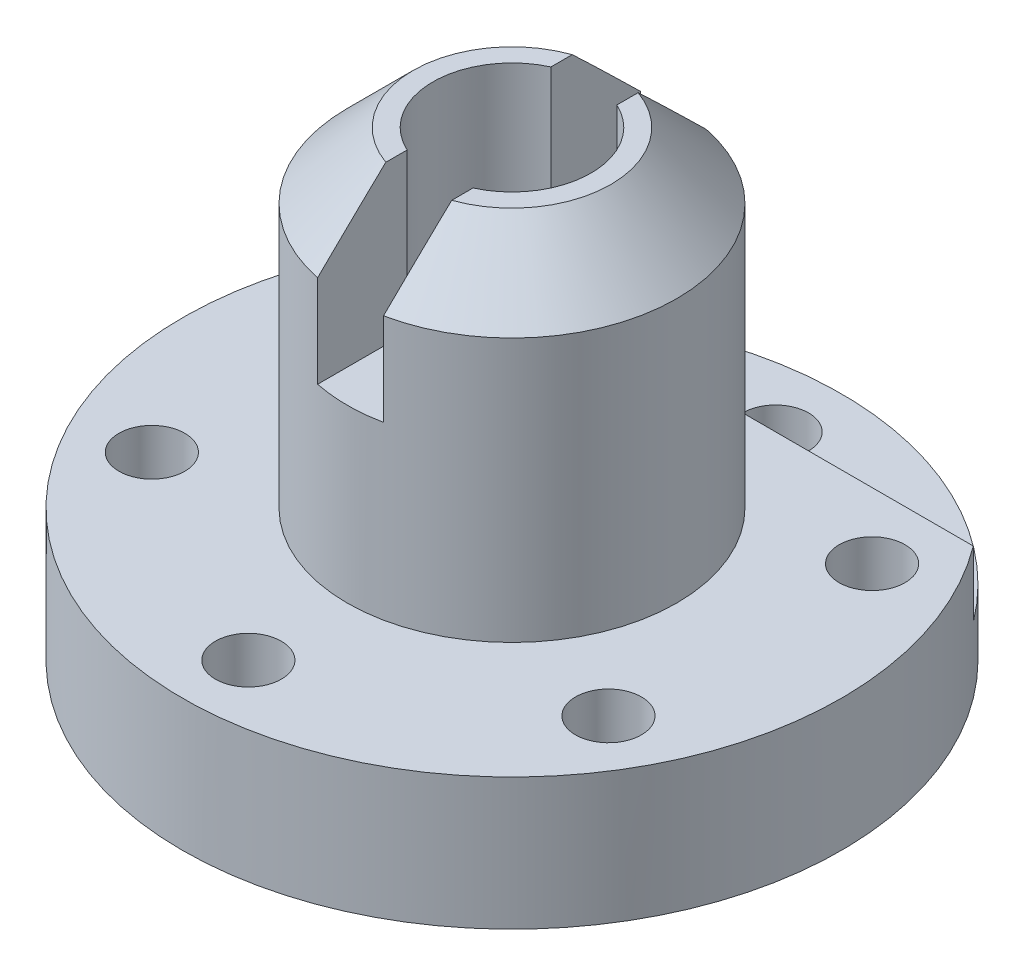
ISO-10303-21;
HEADER;
FILE_DESCRIPTION(('STEP AP214'),'2;1');
FILE_NAME('part.step','',(''),(''),'','','');
FILE_SCHEMA(('AUTOMOTIVE_DESIGN { 1 0 10303 214 1 1 1 1 }'));
ENDSEC;
DATA;
#1=APPLICATION_CONTEXT('core data for automotive mechanical design processes');
#2=APPLICATION_PROTOCOL_DEFINITION('international standard','automotive_design',2000,#1);
#3=PRODUCT_CONTEXT('',#1,'mechanical');
#4=PRODUCT('Part','Part','',(#3));
#5=PRODUCT_RELATED_PRODUCT_CATEGORY('part','',(#4));
#6=PRODUCT_DEFINITION_FORMATION('','',#4);
#7=PRODUCT_DEFINITION_CONTEXT('part definition',#1,'design');
#8=PRODUCT_DEFINITION('design','',#6,#7);
#9=PRODUCT_DEFINITION_SHAPE('','',#8);
#10=(LENGTH_UNIT() NAMED_UNIT(*) SI_UNIT(.MILLI.,.METRE.));
#11=(NAMED_UNIT(*) PLANE_ANGLE_UNIT() SI_UNIT($,.RADIAN.));
#12=(NAMED_UNIT(*) SI_UNIT($,.STERADIAN.) SOLID_ANGLE_UNIT());
#13=UNCERTAINTY_MEASURE_WITH_UNIT(LENGTH_MEASURE(1.E-05),#10,'distance_accuracy_value','');
#14=(GEOMETRIC_REPRESENTATION_CONTEXT(3) GLOBAL_UNCERTAINTY_ASSIGNED_CONTEXT((#13)) GLOBAL_UNIT_ASSIGNED_CONTEXT((#10,
#11,#12)) REPRESENTATION_CONTEXT('',''));
#15=CARTESIAN_POINT('',(0.,0.,0.));
#16=DIRECTION('',(0.,0.,1.));
#17=DIRECTION('',(1.,0.,0.));
#18=AXIS2_PLACEMENT_3D('',#15,#16,#17);
#19=CARTESIAN_POINT('',(0.,35.,0.));
#20=DIRECTION('',(0.,-1.,0.));
#21=DIRECTION('',(0.,0.,-1.));
#22=AXIS2_PLACEMENT_3D('',#19,#20,#21);
#23=CYLINDRICAL_SURFACE('',#22,6.);
#24=CARTESIAN_POINT('',(0.,10.,0.));
#25=DIRECTION('',(0.,1.,0.));
#26=DIRECTION('',(0.,0.,1.));
#27=AXIS2_PLACEMENT_3D('',#24,#25,#26);
#28=CIRCLE('',#27,6.);
#29=CARTESIAN_POINT('',(0.,10.,6.));
#30=VERTEX_POINT('',#29);
#31=EDGE_CURVE('E165',#30,#30,#28,.F.);
#32=ORIENTED_EDGE('',*,*,#31,.T.);
#33=EDGE_LOOP('',(#32));
#34=FACE_BOUND('',#33,.T.);
#35=CARTESIAN_POINT('',(0.,35.,0.));
#36=DIRECTION('',(0.,1.,0.));
#37=DIRECTION('',(0.,0.,1.));
#38=AXIS2_PLACEMENT_3D('',#35,#36,#37);
#39=CIRCLE('',#38,6.);
#40=CARTESIAN_POINT('',(-2.5,35.,-5.45435605731786));
#41=VERTEX_POINT('',#40);
#42=CARTESIAN_POINT('',(-2.5,35.,5.45435605731786));
#43=VERTEX_POINT('',#42);
#44=EDGE_CURVE('E155',#41,#43,#39,.T.);
#45=ORIENTED_EDGE('',*,*,#44,.T.);
#46=DIRECTION('',(0.,-1.,0.));
#47=VECTOR('',#46,1.);
#48=CARTESIAN_POINT('',(-2.5,35.,5.45435605731786));
#49=LINE('',#48,#47);
#50=CARTESIAN_POINT('',(-2.5,23.,5.45435605731786));
#51=VERTEX_POINT('',#50);
#52=EDGE_CURVE('E301',#43,#51,#49,.T.);
#53=ORIENTED_EDGE('',*,*,#52,.T.);
#54=CARTESIAN_POINT('',(0.,23.,0.));
#55=DIRECTION('',(0.,-1.,0.));
#56=DIRECTION('',(0.,0.,-1.));
#57=AXIS2_PLACEMENT_3D('',#54,#55,#56);
#58=CIRCLE('',#57,6.);
#59=CARTESIAN_POINT('',(2.5,23.,5.45435605731786));
#60=VERTEX_POINT('',#59);
#61=EDGE_CURVE('E147',#60,#51,#58,.T.);
#62=ORIENTED_EDGE('',*,*,#61,.F.);
#63=DIRECTION('',(0.,-1.,0.));
#64=VECTOR('',#63,1.);
#65=CARTESIAN_POINT('',(2.5,35.,5.45435605731786));
#66=LINE('',#65,#64);
#67=CARTESIAN_POINT('',(2.5,35.,5.45435605731786));
#68=VERTEX_POINT('',#67);
#69=EDGE_CURVE('E133',#68,#60,#66,.T.);
#70=ORIENTED_EDGE('',*,*,#69,.F.);
#71=CARTESIAN_POINT('',(2.5,35.,-5.45435605731786));
#72=VERTEX_POINT('',#71);
#73=EDGE_CURVE('E145',#68,#72,#39,.T.);
#74=ORIENTED_EDGE('',*,*,#73,.T.);
#75=DIRECTION('',(0.,-1.,0.));
#76=VECTOR('',#75,1.);
#77=CARTESIAN_POINT('',(2.5,35.,-5.45435605731786));
#78=LINE('',#77,#76);
#79=CARTESIAN_POINT('',(2.5,23.,-5.45435605731786));
#80=VERTEX_POINT('',#79);
#81=EDGE_CURVE('E149',#80,#72,#78,.F.);
#82=ORIENTED_EDGE('',*,*,#81,.F.);
#83=CARTESIAN_POINT('',(-2.5,23.,-5.45435605731786));
#84=VERTEX_POINT('',#83);
#85=EDGE_CURVE('E299',#84,#80,#58,.T.);
#86=ORIENTED_EDGE('',*,*,#85,.F.);
#87=DIRECTION('',(0.,-1.,0.));
#88=VECTOR('',#87,1.);
#89=CARTESIAN_POINT('',(-2.5,35.,-5.45435605731786));
#90=LINE('',#89,#88);
#91=EDGE_CURVE('E303',#84,#41,#90,.F.);
#92=ORIENTED_EDGE('',*,*,#91,.T.);
#93=EDGE_LOOP('',(#45,#53,#62,#70,#74,#82,#86,#92));
#94=FACE_BOUND('',#93,.T.);
#95=ADVANCED_FACE('F39',(#34,#94),#23,.F.);
#96=CARTESIAN_POINT('',(0.,35.,0.));
#97=DIRECTION('',(0.,-1.,0.));
#98=DIRECTION('',(0.,0.,-1.));
#99=AXIS2_PLACEMENT_3D('',#96,#97,#98);
#100=CYLINDRICAL_SURFACE('',#99,12.5);
#101=CARTESIAN_POINT('',(0.,10.,0.));
#102=DIRECTION('',(0.,1.,0.));
#103=DIRECTION('',(0.,0.,1.));
#104=AXIS2_PLACEMENT_3D('',#101,#102,#103);
#105=CIRCLE('',#104,12.5);
#106=CARTESIAN_POINT('',(0.,10.,12.5));
#107=VERTEX_POINT('',#106);
#108=EDGE_CURVE('E154',#107,#107,#105,.F.);
#109=ORIENTED_EDGE('',*,*,#108,.F.);
#110=EDGE_LOOP('',(#109));
#111=FACE_BOUND('',#110,.T.);
#112=DIRECTION('',(0.,-1.,0.));
#113=VECTOR('',#112,1.);
#114=CARTESIAN_POINT('',(-2.5,35.,12.2474487139159));
#115=LINE('',#114,#113);
#116=CARTESIAN_POINT('',(-2.5,30.,12.2474487139159));
#117=VERTEX_POINT('',#116);
#118=CARTESIAN_POINT('',(-2.5,23.,12.2474487139159));
#119=VERTEX_POINT('',#118);
#120=EDGE_CURVE('E306',#117,#119,#115,.T.);
#121=ORIENTED_EDGE('',*,*,#120,.F.);
#122=CARTESIAN_POINT('',(0.,30.,0.));
#123=DIRECTION('',(0.,1.,0.));
#124=DIRECTION('',(0.,0.,1.));
#125=AXIS2_PLACEMENT_3D('',#122,#123,#124);
#126=CIRCLE('',#125,12.5);
#127=CARTESIAN_POINT('',(-2.5,30.,-12.2474487139159));
#128=VERTEX_POINT('',#127);
#129=EDGE_CURVE('E215',#117,#128,#126,.F.);
#130=ORIENTED_EDGE('',*,*,#129,.T.);
#131=DIRECTION('',(0.,-1.,0.));
#132=VECTOR('',#131,1.);
#133=CARTESIAN_POINT('',(-2.5,35.,-12.2474487139159));
#134=LINE('',#133,#132);
#135=CARTESIAN_POINT('',(-2.5,23.,-12.2474487139159));
#136=VERTEX_POINT('',#135);
#137=EDGE_CURVE('E148',#136,#128,#134,.F.);
#138=ORIENTED_EDGE('',*,*,#137,.F.);
#139=CARTESIAN_POINT('',(0.,23.,0.));
#140=DIRECTION('',(0.,-1.,0.));
#141=DIRECTION('',(0.,0.,-1.));
#142=AXIS2_PLACEMENT_3D('',#139,#140,#141);
#143=CIRCLE('',#142,12.5);
#144=CARTESIAN_POINT('',(2.5,23.,-12.2474487139159));
#145=VERTEX_POINT('',#144);
#146=EDGE_CURVE('E176',#136,#145,#143,.T.);
#147=ORIENTED_EDGE('',*,*,#146,.T.);
#148=DIRECTION('',(0.,-1.,0.));
#149=VECTOR('',#148,1.);
#150=CARTESIAN_POINT('',(2.5,35.,-12.2474487139159));
#151=LINE('',#150,#149);
#152=CARTESIAN_POINT('',(2.5,30.,-12.2474487139159));
#153=VERTEX_POINT('',#152);
#154=EDGE_CURVE('E313',#145,#153,#151,.F.);
#155=ORIENTED_EDGE('',*,*,#154,.T.);
#156=CARTESIAN_POINT('',(0.,30.,0.));
#157=DIRECTION('',(0.,1.,0.));
#158=DIRECTION('',(0.,0.,1.));
#159=AXIS2_PLACEMENT_3D('',#156,#157,#158);
#160=CIRCLE('',#159,12.5);
#161=CARTESIAN_POINT('',(2.5,30.,12.2474487139159));
#162=VERTEX_POINT('',#161);
#163=EDGE_CURVE('E194',#153,#162,#160,.F.);
#164=ORIENTED_EDGE('',*,*,#163,.T.);
#165=DIRECTION('',(0.,-1.,0.));
#166=VECTOR('',#165,1.);
#167=CARTESIAN_POINT('',(2.5,35.,12.2474487139159));
#168=LINE('',#167,#166);
#169=CARTESIAN_POINT('',(2.5,23.,12.2474487139159));
#170=VERTEX_POINT('',#169);
#171=EDGE_CURVE('E311',#162,#170,#168,.T.);
#172=ORIENTED_EDGE('',*,*,#171,.T.);
#173=EDGE_CURVE('E179',#170,#119,#143,.T.);
#174=ORIENTED_EDGE('',*,*,#173,.T.);
#175=EDGE_LOOP('',(#121,#130,#138,#147,#155,#164,#172,#174));
#176=FACE_BOUND('',#175,.T.);
#177=ADVANCED_FACE('F243',(#111,#176),#100,.T.);
#178=CARTESIAN_POINT('',(0.,35.,0.));
#179=DIRECTION('',(0.,1.,0.));
#180=DIRECTION('',(0.,0.,1.));
#181=AXIS2_PLACEMENT_3D('',#178,#179,#180);
#182=PLANE('',#181);
#183=DIRECTION('',(0.,0.,-1.));
#184=VECTOR('',#183,1.);
#185=CARTESIAN_POINT('',(-2.5,35.,0.));
#186=LINE('',#185,#184);
#187=CARTESIAN_POINT('',(-2.5,35.,-7.07106781186548));
#188=VERTEX_POINT('',#187);
#189=EDGE_CURVE('E137',#41,#188,#186,.T.);
#190=ORIENTED_EDGE('',*,*,#189,.T.);
#191=CARTESIAN_POINT('',(0.,35.,0.));
#192=DIRECTION('',(0.,1.,0.));
#193=DIRECTION('',(0.,0.,1.));
#194=AXIS2_PLACEMENT_3D('',#191,#192,#193);
#195=CIRCLE('',#194,7.5);
#196=CARTESIAN_POINT('',(-2.5,35.,7.07106781186548));
#197=VERTEX_POINT('',#196);
#198=EDGE_CURVE('E185',#188,#197,#195,.T.);
#199=ORIENTED_EDGE('',*,*,#198,.T.);
#200=EDGE_CURVE('E175',#197,#43,#186,.T.);
#201=ORIENTED_EDGE('',*,*,#200,.T.);
#202=ORIENTED_EDGE('',*,*,#44,.F.);
#203=EDGE_LOOP('',(#190,#199,#201,#202));
#204=FACE_BOUND('',#203,.T.);
#205=ADVANCED_FACE('F242',(#204),#182,.T.);
#206=CARTESIAN_POINT('',(0.,10.,0.));
#207=DIRECTION('',(0.,-1.,0.));
#208=DIRECTION('',(0.,0.,-1.));
#209=AXIS2_PLACEMENT_3D('',#206,#207,#208);
#210=CYLINDRICAL_SURFACE('',#209,25.);
#211=CARTESIAN_POINT('',(0.,0.,0.));
#212=DIRECTION('',(0.,1.,0.));
#213=DIRECTION('',(0.,0.,1.));
#214=AXIS2_PLACEMENT_3D('',#211,#212,#213);
#215=CIRCLE('',#214,25.);
#216=CARTESIAN_POINT('',(0.,0.,25.));
#217=VERTEX_POINT('',#216);
#218=EDGE_CURVE('E158',#217,#217,#215,.T.);
#219=ORIENTED_EDGE('',*,*,#218,.T.);
#220=EDGE_LOOP('',(#219));
#221=FACE_BOUND('',#220,.T.);
#222=DIRECTION('',(0.,-1.,0.));
#223=VECTOR('',#222,1.);
#224=CARTESIAN_POINT('',(20.,51.2310562561766,-15.));
#225=LINE('',#224,#223);
#226=CARTESIAN_POINT('',(20.,10.,-15.));
#227=VERTEX_POINT('',#226);
#228=CARTESIAN_POINT('',(20.,5.,-15.));
#229=VERTEX_POINT('',#228);
#230=EDGE_CURVE('E287',#227,#229,#225,.T.);
#231=ORIENTED_EDGE('',*,*,#230,.F.);
#232=CARTESIAN_POINT('',(0.,10.,0.));
#233=DIRECTION('',(0.,1.,0.));
#234=DIRECTION('',(0.,0.,1.));
#235=AXIS2_PLACEMENT_3D('',#232,#233,#234);
#236=CIRCLE('',#235,25.);
#237=CARTESIAN_POINT('',(-20.,10.,-15.));
#238=VERTEX_POINT('',#237);
#239=EDGE_CURVE('E168',#238,#227,#236,.T.);
#240=ORIENTED_EDGE('',*,*,#239,.F.);
#241=DIRECTION('',(0.,-1.,0.));
#242=VECTOR('',#241,1.);
#243=CARTESIAN_POINT('',(-20.,51.2310562561766,-15.));
#244=LINE('',#243,#242);
#245=CARTESIAN_POINT('',(-20.,5.,-15.));
#246=VERTEX_POINT('',#245);
#247=EDGE_CURVE('E162',#238,#246,#244,.T.);
#248=ORIENTED_EDGE('',*,*,#247,.T.);
#249=CARTESIAN_POINT('',(0.,5.,0.));
#250=DIRECTION('',(0.,1.,0.));
#251=DIRECTION('',(0.,0.,1.));
#252=AXIS2_PLACEMENT_3D('',#249,#250,#251);
#253=CIRCLE('',#252,25.);
#254=EDGE_CURVE('E289',#229,#246,#253,.T.);
#255=ORIENTED_EDGE('',*,*,#254,.F.);
#256=EDGE_LOOP('',(#231,#240,#248,#255));
#257=FACE_BOUND('',#256,.T.);
#258=ADVANCED_FACE('F205',(#221,#257),#210,.T.);
#259=CARTESIAN_POINT('',(0.,10.,0.));
#260=DIRECTION('',(0.,1.,0.));
#261=DIRECTION('',(0.,0.,1.));
#262=AXIS2_PLACEMENT_3D('',#259,#260,#261);
#263=PLANE('',#262);
#264=CARTESIAN_POINT('',(17.3205080756887,10.,-10.0000000000002));
#265=DIRECTION('',(0.,1.,0.));
#266=DIRECTION('',(0.,0.,1.));
#267=AXIS2_PLACEMENT_3D('',#264,#265,#266);
#268=CIRCLE('',#267,2.5);
#269=CARTESIAN_POINT('',(17.3205080756887,10.,-7.5000000000002));
#270=VERTEX_POINT('',#269);
#271=EDGE_CURVE('E323',#270,#270,#268,.F.);
#272=ORIENTED_EDGE('',*,*,#271,.T.);
#273=EDGE_LOOP('',(#272));
#274=FACE_BOUND('',#273,.T.);
#275=CARTESIAN_POINT('',(17.3205080756889,10.,9.99999999999984));
#276=DIRECTION('',(0.,1.,0.));
#277=DIRECTION('',(0.,0.,1.));
#278=AXIS2_PLACEMENT_3D('',#275,#276,#277);
#279=CIRCLE('',#278,2.5);
#280=CARTESIAN_POINT('',(17.3205080756889,10.,12.4999999999998));
#281=VERTEX_POINT('',#280);
#282=EDGE_CURVE('E326',#281,#281,#279,.F.);
#283=ORIENTED_EDGE('',*,*,#282,.T.);
#284=EDGE_LOOP('',(#283));
#285=FACE_BOUND('',#284,.T.);
#286=CARTESIAN_POINT('',(0.,10.,20.));
#287=DIRECTION('',(0.,1.,0.));
#288=DIRECTION('',(0.,0.,1.));
#289=AXIS2_PLACEMENT_3D('',#286,#287,#288);
#290=CIRCLE('',#289,2.5);
#291=CARTESIAN_POINT('',(0.,10.,22.5));
#292=VERTEX_POINT('',#291);
#293=EDGE_CURVE('E329',#292,#292,#290,.F.);
#294=ORIENTED_EDGE('',*,*,#293,.T.);
#295=EDGE_LOOP('',(#294));
#296=FACE_BOUND('',#295,.T.);
#297=CARTESIAN_POINT('',(-17.3205080756887,10.,10.0000000000001));
#298=DIRECTION('',(0.,1.,0.));
#299=DIRECTION('',(0.,0.,1.));
#300=AXIS2_PLACEMENT_3D('',#297,#298,#299);
#301=CIRCLE('',#300,2.5);
#302=CARTESIAN_POINT('',(-17.3205080756887,10.,12.5000000000001));
#303=VERTEX_POINT('',#302);
#304=EDGE_CURVE('E332',#303,#303,#301,.F.);
#305=ORIENTED_EDGE('',*,*,#304,.T.);
#306=EDGE_LOOP('',(#305));
#307=FACE_BOUND('',#306,.T.);
#308=CARTESIAN_POINT('',(-17.3205080756888,10.,-9.99999999999996));
#309=DIRECTION('',(0.,1.,0.));
#310=DIRECTION('',(0.,0.,1.));
#311=AXIS2_PLACEMENT_3D('',#308,#309,#310);
#312=CIRCLE('',#311,2.5);
#313=CARTESIAN_POINT('',(-17.3205080756888,10.,-7.49999999999996));
#314=VERTEX_POINT('',#313);
#315=EDGE_CURVE('E335',#314,#314,#312,.F.);
#316=ORIENTED_EDGE('',*,*,#315,.T.);
#317=EDGE_LOOP('',(#316));
#318=FACE_BOUND('',#317,.T.);
#319=ORIENTED_EDGE('',*,*,#108,.T.);
#320=EDGE_LOOP('',(#319));
#321=FACE_BOUND('',#320,.T.);
#322=ORIENTED_EDGE('',*,*,#239,.T.);
#323=DIRECTION('',(1.,0.,0.));
#324=VECTOR('',#323,1.);
#325=CARTESIAN_POINT('',(0.,10.,-15.));
#326=LINE('',#325,#324);
#327=EDGE_CURVE('E160',#238,#227,#326,.T.);
#328=ORIENTED_EDGE('',*,*,#327,.F.);
#329=EDGE_LOOP('',(#322,#328));
#330=FACE_BOUND('',#329,.T.);
#331=ADVANCED_FACE('F250',(#274,#285,#296,#307,#318,#321,#330),#263,.T.);
#332=CARTESIAN_POINT('',(0.,0.,0.));
#333=DIRECTION('',(0.,1.,0.));
#334=DIRECTION('',(0.,0.,1.));
#335=AXIS2_PLACEMENT_3D('',#332,#333,#334);
#336=PLANE('',#335);
#337=CARTESIAN_POINT('',(17.3205080756887,0.,-10.0000000000002));
#338=DIRECTION('',(0.,1.,0.));
#339=DIRECTION('',(-0.866025403784433,0.,0.50000000000001));
#340=AXIS2_PLACEMENT_3D('',#337,#338,#339);
#341=CIRCLE('',#340,2.5);
#342=CARTESIAN_POINT('',(15.1554445662276,0.,-8.75000000000018));
#343=VERTEX_POINT('',#342);
#344=EDGE_CURVE('E260',#343,#343,#341,.T.);
#345=ORIENTED_EDGE('',*,*,#344,.T.);
#346=EDGE_LOOP('',(#345));
#347=FACE_BOUND('',#346,.T.);
#348=CARTESIAN_POINT('',(17.3205080756889,0.,9.99999999999984));
#349=DIRECTION('',(0.,1.,0.));
#350=DIRECTION('',(-0.866025403784443,0.,-0.499999999999992));
#351=AXIS2_PLACEMENT_3D('',#348,#349,#350);
#352=CIRCLE('',#351,2.5);
#353=CARTESIAN_POINT('',(15.1554445662278,0.,8.74999999999986));
#354=VERTEX_POINT('',#353);
#355=EDGE_CURVE('E264',#354,#354,#352,.T.);
#356=ORIENTED_EDGE('',*,*,#355,.T.);
#357=EDGE_LOOP('',(#356));
#358=FACE_BOUND('',#357,.T.);
#359=CARTESIAN_POINT('',(0.,0.,20.));
#360=DIRECTION('',(0.,1.,0.));
#361=DIRECTION('',(0.,0.,-1.));
#362=AXIS2_PLACEMENT_3D('',#359,#360,#361);
#363=CIRCLE('',#362,2.5);
#364=CARTESIAN_POINT('',(0.,0.,17.5));
#365=VERTEX_POINT('',#364);
#366=EDGE_CURVE('E268',#365,#365,#363,.T.);
#367=ORIENTED_EDGE('',*,*,#366,.T.);
#368=EDGE_LOOP('',(#367));
#369=FACE_BOUND('',#368,.T.);
#370=CARTESIAN_POINT('',(-17.3205080756887,0.,10.0000000000001));
#371=DIRECTION('',(0.,1.,0.));
#372=DIRECTION('',(0.866025403784436,0.,-0.500000000000004));
#373=AXIS2_PLACEMENT_3D('',#370,#371,#372);
#374=CIRCLE('',#373,2.5);
#375=CARTESIAN_POINT('',(-15.1554445662276,0.,8.75000000000007));
#376=VERTEX_POINT('',#375);
#377=EDGE_CURVE('E272',#376,#376,#374,.T.);
#378=ORIENTED_EDGE('',*,*,#377,.T.);
#379=EDGE_LOOP('',(#378));
#380=FACE_BOUND('',#379,.T.);
#381=CARTESIAN_POINT('',(-17.3205080756888,0.,-9.99999999999996));
#382=DIRECTION('',(0.,1.,0.));
#383=DIRECTION('',(0.86602540378444,0.,0.499999999999998));
#384=AXIS2_PLACEMENT_3D('',#381,#382,#383);
#385=CIRCLE('',#384,2.5);
#386=CARTESIAN_POINT('',(-15.1554445662277,0.,-8.74999999999997));
#387=VERTEX_POINT('',#386);
#388=EDGE_CURVE('E276',#387,#387,#385,.T.);
#389=ORIENTED_EDGE('',*,*,#388,.T.);
#390=EDGE_LOOP('',(#389));
#391=FACE_BOUND('',#390,.T.);
#392=CARTESIAN_POINT('',(0.,0.,-20.));
#393=DIRECTION('',(0.,1.,0.));
#394=DIRECTION('',(0.,0.,1.));
#395=AXIS2_PLACEMENT_3D('',#392,#393,#394);
#396=CIRCLE('',#395,2.5);
#397=CARTESIAN_POINT('',(0.,0.,-17.5));
#398=VERTEX_POINT('',#397);
#399=EDGE_CURVE('E184',#398,#398,#396,.T.);
#400=ORIENTED_EDGE('',*,*,#399,.T.);
#401=EDGE_LOOP('',(#400));
#402=FACE_BOUND('',#401,.T.);
#403=ORIENTED_EDGE('',*,*,#218,.F.);
#404=EDGE_LOOP('',(#403));
#405=FACE_BOUND('',#404,.T.);
#406=ADVANCED_FACE('F241',(#347,#358,#369,#380,#391,#402,#405),#336,.F.);
#407=DIRECTION('',(0.,0.,-1.));
#408=VECTOR('',#407,1.);
#409=CARTESIAN_POINT('',(2.5,35.,0.));
#410=LINE('',#409,#408);
#411=CARTESIAN_POINT('',(2.5,35.,7.07106781186547));
#412=VERTEX_POINT('',#411);
#413=EDGE_CURVE('E129',#412,#68,#410,.T.);
#414=ORIENTED_EDGE('',*,*,#413,.F.);
#415=CARTESIAN_POINT('',(0.,35.,0.));
#416=DIRECTION('',(0.,1.,0.));
#417=DIRECTION('',(0.,0.,1.));
#418=AXIS2_PLACEMENT_3D('',#415,#416,#417);
#419=CIRCLE('',#418,7.5);
#420=CARTESIAN_POINT('',(2.5,35.,-7.07106781186547));
#421=VERTEX_POINT('',#420);
#422=EDGE_CURVE('E214',#412,#421,#419,.T.);
#423=ORIENTED_EDGE('',*,*,#422,.T.);
#424=EDGE_CURVE('E138',#72,#421,#410,.T.);
#425=ORIENTED_EDGE('',*,*,#424,.F.);
#426=ORIENTED_EDGE('',*,*,#73,.F.);
#427=EDGE_LOOP('',(#414,#423,#425,#426));
#428=FACE_BOUND('',#427,.T.);
#429=ADVANCED_FACE('F152',(#428),#182,.T.);
#430=ORIENTED_EDGE('',*,*,#31,.F.);
#431=EDGE_LOOP('',(#430));
#432=FACE_BOUND('',#431,.T.);
#433=ADVANCED_FACE('F237',(#432),#263,.T.);
#434=CARTESIAN_POINT('',(0.,51.2310562561766,-15.));
#435=DIRECTION('',(0.,0.,-1.));
#436=DIRECTION('',(-1.,0.,0.));
#437=AXIS2_PLACEMENT_3D('',#434,#435,#436);
#438=PLANE('',#437);
#439=ORIENTED_EDGE('',*,*,#327,.T.);
#440=ORIENTED_EDGE('',*,*,#230,.T.);
#441=DIRECTION('',(1.,0.,0.));
#442=VECTOR('',#441,1.);
#443=CARTESIAN_POINT('',(0.,5.,-15.));
#444=LINE('',#443,#442);
#445=EDGE_CURVE('E292',#246,#229,#444,.T.);
#446=ORIENTED_EDGE('',*,*,#445,.F.);
#447=ORIENTED_EDGE('',*,*,#247,.F.);
#448=EDGE_LOOP('',(#439,#440,#446,#447));
#449=FACE_BOUND('',#448,.T.);
#450=ADVANCED_FACE('F233',(#449),#438,.T.);
#451=CARTESIAN_POINT('',(0.,5.,0.));
#452=DIRECTION('',(0.,1.,0.));
#453=DIRECTION('',(0.,0.,1.));
#454=AXIS2_PLACEMENT_3D('',#451,#452,#453);
#455=PLANE('',#454);
#456=CARTESIAN_POINT('',(0.,5.,-20.));
#457=DIRECTION('',(0.,1.,0.));
#458=DIRECTION('',(0.,0.,1.));
#459=AXIS2_PLACEMENT_3D('',#456,#457,#458);
#460=CIRCLE('',#459,2.5);
#461=CARTESIAN_POINT('',(0.,5.,-17.5));
#462=VERTEX_POINT('',#461);
#463=EDGE_CURVE('E180',#462,#462,#460,.F.);
#464=ORIENTED_EDGE('',*,*,#463,.T.);
#465=EDGE_LOOP('',(#464));
#466=FACE_BOUND('',#465,.T.);
#467=ORIENTED_EDGE('',*,*,#445,.T.);
#468=ORIENTED_EDGE('',*,*,#254,.T.);
#469=EDGE_LOOP('',(#467,#468));
#470=FACE_BOUND('',#469,.T.);
#471=ADVANCED_FACE('F230',(#466,#470),#455,.T.);
#472=CARTESIAN_POINT('',(2.5,0.,-25.));
#473=DIRECTION('',(1.,0.,0.));
#474=DIRECTION('',(0.,0.,-1.));
#475=AXIS2_PLACEMENT_3D('',#472,#473,#474);
#476=PLANE('',#475);
#477=ORIENTED_EDGE('',*,*,#424,.T.);
#478=CARTESIAN_POINT('',(2.5,35.,-7.07106781186547));
#479=CARTESIAN_POINT('',(2.5,34.7942710151592,-7.28925185426982));
#480=CARTESIAN_POINT('',(2.5,34.5880077931108,-7.50693046196766));
#481=CARTESIAN_POINT('',(2.5,34.1746086681922,-7.94145534958885));
#482=CARTESIAN_POINT('',(2.5,33.96747277022,-8.15830163417075));
#483=CARTESIAN_POINT('',(2.5,33.5525259791795,-8.59133847307312));
#484=CARTESIAN_POINT('',(2.5,33.3447150998693,-8.80752904058768));
#485=CARTESIAN_POINT('',(2.5,32.928541956577,-9.23937931718984));
#486=CARTESIAN_POINT('',(2.5,32.7201796917115,-9.45503902542584));
#487=CARTESIAN_POINT('',(2.5,32.0944309736618,-10.101364328682));
#488=CARTESIAN_POINT('',(2.5,31.6763761449851,-10.5313828218528));
#489=CARTESIAN_POINT('',(2.5,31.0483673520427,-11.175514838877));
#490=CARTESIAN_POINT('',(2.5,30.8388744262294,-11.3900785049165));
#491=CARTESIAN_POINT('',(2.5,30.4196245491057,-11.8189471296121));
#492=CARTESIAN_POINT('',(2.5,30.2098675981866,-12.0332520886506));
#493=CARTESIAN_POINT('',(2.5,30.,-12.2474487139159));
#494=B_SPLINE_CURVE_WITH_KNOTS('',3,(#478,#479,#480,#481,#482,#483,#484,#485,#486,#487,#488,
#489,#490,#491,#492,#493),.UNSPECIFIED.,.F.,.F.,(4,2,2,2,2,2,2,4),(0.,0.899640709374006,
1.79927637603901,2.69889381883337,3.59851270381598,5.3977225269921,6.29734660486977,
7.19696935114769),.UNSPECIFIED.);
#495=EDGE_CURVE('E52',#421,#153,#494,.T.);
#496=ORIENTED_EDGE('',*,*,#495,.T.);
#497=ORIENTED_EDGE('',*,*,#154,.F.);
#498=DIRECTION('',(0.,0.,1.));
#499=VECTOR('',#498,1.);
#500=CARTESIAN_POINT('',(2.5,23.,-25.));
#501=LINE('',#500,#499);
#502=EDGE_CURVE('E318',#145,#80,#501,.T.);
#503=ORIENTED_EDGE('',*,*,#502,.T.);
#504=ORIENTED_EDGE('',*,*,#81,.T.);
#505=EDGE_LOOP('',(#477,#496,#497,#503,#504));
#506=FACE_BOUND('',#505,.T.);
#507=ADVANCED_FACE('F223',(#506),#476,.F.);
#508=CARTESIAN_POINT('',(-2.5,0.,-25.));
#509=DIRECTION('',(1.,0.,0.));
#510=DIRECTION('',(0.,0.,-1.));
#511=AXIS2_PLACEMENT_3D('',#508,#509,#510);
#512=PLANE('',#511);
#513=ORIENTED_EDGE('',*,*,#137,.T.);
#514=CARTESIAN_POINT('',(-2.5,30.,-12.2474487139159));
#515=CARTESIAN_POINT('',(-2.5,30.2098675981865,-12.0332520886506));
#516=CARTESIAN_POINT('',(-2.5,30.4196245491057,-11.8189471296121));
#517=CARTESIAN_POINT('',(-2.5,30.8388744262294,-11.3900785049165));
#518=CARTESIAN_POINT('',(-2.5,31.0483673520427,-11.175514838877));
#519=CARTESIAN_POINT('',(-2.5,31.6763761449851,-10.5313828218528));
#520=CARTESIAN_POINT('',(-2.5,32.0944309736618,-10.101364328682));
#521=CARTESIAN_POINT('',(-2.5,32.7201796917115,-9.45503902542585));
#522=CARTESIAN_POINT('',(-2.5,32.928541956577,-9.23937931718984));
#523=CARTESIAN_POINT('',(-2.5,33.3447150998693,-8.80752904058769));
#524=CARTESIAN_POINT('',(-2.5,33.5525259791795,-8.59133847307312));
#525=CARTESIAN_POINT('',(-2.5,33.96747277022,-8.15830163417075));
#526=CARTESIAN_POINT('',(-2.5,34.1746086681922,-7.94145534958885));
#527=CARTESIAN_POINT('',(-2.5,34.5880077931108,-7.50693046196766));
#528=CARTESIAN_POINT('',(-2.5,34.7942710151592,-7.28925185426982));
#529=CARTESIAN_POINT('',(-2.5,35.,-7.07106781186548));
#530=B_SPLINE_CURVE_WITH_KNOTS('',3,(#514,#515,#516,#517,#518,#519,#520,#521,#522,#523,#524,
#525,#526,#527,#528,#529),.UNSPECIFIED.,.F.,.F.,(4,2,2,2,2,2,2,4),(0.,0.899622746277924,
1.79924682415559,3.59845664733171,4.49807553231432,5.39769297510868,6.29732864177369,
7.19696935114769),.UNSPECIFIED.);
#531=EDGE_CURVE('E209',#128,#188,#530,.T.);
#532=ORIENTED_EDGE('',*,*,#531,.T.);
#533=ORIENTED_EDGE('',*,*,#189,.F.);
#534=ORIENTED_EDGE('',*,*,#91,.F.);
#535=DIRECTION('',(0.,0.,1.));
#536=VECTOR('',#535,1.);
#537=CARTESIAN_POINT('',(-2.5,23.,-25.));
#538=LINE('',#537,#536);
#539=EDGE_CURVE('E316',#136,#84,#538,.T.);
#540=ORIENTED_EDGE('',*,*,#539,.F.);
#541=EDGE_LOOP('',(#513,#532,#533,#534,#540));
#542=FACE_BOUND('',#541,.T.);
#543=ADVANCED_FACE('F436',(#542),#512,.T.);
#544=CARTESIAN_POINT('',(0.,23.,-25.));
#545=DIRECTION('',(0.,-1.,0.));
#546=DIRECTION('',(0.,0.,-1.));
#547=AXIS2_PLACEMENT_3D('',#544,#545,#546);
#548=PLANE('',#547);
#549=ORIENTED_EDGE('',*,*,#85,.T.);
#550=ORIENTED_EDGE('',*,*,#502,.F.);
#551=ORIENTED_EDGE('',*,*,#146,.F.);
#552=ORIENTED_EDGE('',*,*,#539,.T.);
#553=EDGE_LOOP('',(#549,#550,#551,#552));
#554=FACE_BOUND('',#553,.T.);
#555=ADVANCED_FACE('F228',(#554),#548,.F.);
#556=ORIENTED_EDGE('',*,*,#61,.T.);
#557=EDGE_CURVE('E319',#51,#119,#538,.T.);
#558=ORIENTED_EDGE('',*,*,#557,.T.);
#559=ORIENTED_EDGE('',*,*,#173,.F.);
#560=EDGE_CURVE('E183',#60,#170,#501,.T.);
#561=ORIENTED_EDGE('',*,*,#560,.F.);
#562=EDGE_LOOP('',(#556,#558,#559,#561));
#563=FACE_BOUND('',#562,.T.);
#564=ADVANCED_FACE('F224',(#563),#548,.F.);
#565=ORIENTED_EDGE('',*,*,#200,.F.);
#566=CARTESIAN_POINT('',(-2.5,35.,7.07106781186548));
#567=CARTESIAN_POINT('',(-2.5,34.7942710151592,7.28925185426982));
#568=CARTESIAN_POINT('',(-2.5,34.5880077931108,7.50693046196766));
#569=CARTESIAN_POINT('',(-2.5,34.1746086681922,7.94145534958885));
#570=CARTESIAN_POINT('',(-2.5,33.96747277022,8.15830163417075));
#571=CARTESIAN_POINT('',(-2.5,33.5525259791795,8.59133847307312));
#572=CARTESIAN_POINT('',(-2.5,33.3447150998693,8.80752904058768));
#573=CARTESIAN_POINT('',(-2.5,32.928541956577,9.23937931718984));
#574=CARTESIAN_POINT('',(-2.5,32.7201796917115,9.45503902542585));
#575=CARTESIAN_POINT('',(-2.5,32.0944309736618,10.101364328682));
#576=CARTESIAN_POINT('',(-2.5,31.6763761449851,10.5313828218528));
#577=CARTESIAN_POINT('',(-2.5,31.0483673520427,11.175514838877));
#578=CARTESIAN_POINT('',(-2.5,30.8388744262294,11.3900785049165));
#579=CARTESIAN_POINT('',(-2.5,30.4196245491057,11.8189471296121));
#580=CARTESIAN_POINT('',(-2.5,30.2098675981866,12.0332520886506));
#581=CARTESIAN_POINT('',(-2.5,30.,12.2474487139159));
#582=B_SPLINE_CURVE_WITH_KNOTS('',3,(#566,#567,#568,#569,#570,#571,#572,#573,#574,#575,#576,
#577,#578,#579,#580,#581),.UNSPECIFIED.,.F.,.F.,(4,2,2,2,2,2,2,4),(0.,0.899640709374007,
1.79927637603901,2.69889381883337,3.59851270381598,5.3977225269921,6.29734660486977,
7.19696935114769),.UNSPECIFIED.);
#583=EDGE_CURVE('E188',#197,#117,#582,.T.);
#584=ORIENTED_EDGE('',*,*,#583,.T.);
#585=ORIENTED_EDGE('',*,*,#120,.T.);
#586=ORIENTED_EDGE('',*,*,#557,.F.);
#587=ORIENTED_EDGE('',*,*,#52,.F.);
#588=EDGE_LOOP('',(#565,#584,#585,#586,#587));
#589=FACE_BOUND('',#588,.T.);
#590=ADVANCED_FACE('F196',(#589),#512,.T.);
#591=ORIENTED_EDGE('',*,*,#171,.F.);
#592=CARTESIAN_POINT('',(2.5,30.,12.2474487139159));
#593=CARTESIAN_POINT('',(2.5,30.2098675981865,12.0332520886506));
#594=CARTESIAN_POINT('',(2.5,30.4196245491057,11.8189471296121));
#595=CARTESIAN_POINT('',(2.5,30.8388744262294,11.3900785049165));
#596=CARTESIAN_POINT('',(2.5,31.0483673520427,11.175514838877));
#597=CARTESIAN_POINT('',(2.5,31.6763761449851,10.5313828218528));
#598=CARTESIAN_POINT('',(2.5,32.0944309736618,10.101364328682));
#599=CARTESIAN_POINT('',(2.5,32.7201796917115,9.45503902542585));
#600=CARTESIAN_POINT('',(2.5,32.928541956577,9.23937931718984));
#601=CARTESIAN_POINT('',(2.5,33.3447150998693,8.80752904058769));
#602=CARTESIAN_POINT('',(2.5,33.5525259791795,8.59133847307312));
#603=CARTESIAN_POINT('',(2.5,33.96747277022,8.15830163417076));
#604=CARTESIAN_POINT('',(2.5,34.1746086681922,7.94145534958885));
#605=CARTESIAN_POINT('',(2.5,34.5880077931108,7.50693046196767));
#606=CARTESIAN_POINT('',(2.5,34.7942710151592,7.28925185426982));
#607=CARTESIAN_POINT('',(2.5,35.,7.07106781186547));
#608=B_SPLINE_CURVE_WITH_KNOTS('',3,(#592,#593,#594,#595,#596,#597,#598,#599,#600,#601,#602,
#603,#604,#605,#606,#607),.UNSPECIFIED.,.F.,.F.,(4,2,2,2,2,2,2,4),(0.,0.899622746277923,
1.79924682415559,3.59845664733171,4.49807553231432,5.39769297510867,6.29732864177368,
7.1969693511477),.UNSPECIFIED.);
#609=EDGE_CURVE('E11',#162,#412,#608,.T.);
#610=ORIENTED_EDGE('',*,*,#609,.T.);
#611=ORIENTED_EDGE('',*,*,#413,.T.);
#612=ORIENTED_EDGE('',*,*,#69,.T.);
#613=ORIENTED_EDGE('',*,*,#560,.T.);
#614=EDGE_LOOP('',(#591,#610,#611,#612,#613));
#615=FACE_BOUND('',#614,.T.);
#616=ADVANCED_FACE('F131',(#615),#476,.F.);
#617=CARTESIAN_POINT('',(0.,35.,-20.));
#618=DIRECTION('',(0.,-1.,0.));
#619=DIRECTION('',(0.,0.,-1.));
#620=AXIS2_PLACEMENT_3D('',#617,#618,#619);
#621=CYLINDRICAL_SURFACE('',#620,2.5);
#622=ORIENTED_EDGE('',*,*,#463,.F.);
#623=EDGE_LOOP('',(#622));
#624=FACE_BOUND('',#623,.T.);
#625=ORIENTED_EDGE('',*,*,#399,.F.);
#626=EDGE_LOOP('',(#625));
#627=FACE_BOUND('',#626,.T.);
#628=ADVANCED_FACE('F222',(#624,#627),#621,.F.);
#629=CARTESIAN_POINT('',(-17.3205080756888,35.,-9.99999999999996));
#630=DIRECTION('',(0.,-1.,0.));
#631=DIRECTION('',(0.,0.,-1.));
#632=AXIS2_PLACEMENT_3D('',#629,#630,#631);
#633=CYLINDRICAL_SURFACE('',#632,2.5);
#634=ORIENTED_EDGE('',*,*,#315,.F.);
#635=EDGE_LOOP('',(#634));
#636=FACE_BOUND('',#635,.T.);
#637=ORIENTED_EDGE('',*,*,#388,.F.);
#638=EDGE_LOOP('',(#637));
#639=FACE_BOUND('',#638,.T.);
#640=ADVANCED_FACE('F346',(#636,#639),#633,.F.);
#641=CARTESIAN_POINT('',(-17.3205080756887,35.,10.0000000000001));
#642=DIRECTION('',(0.,-1.,0.));
#643=DIRECTION('',(0.,0.,-1.));
#644=AXIS2_PLACEMENT_3D('',#641,#642,#643);
#645=CYLINDRICAL_SURFACE('',#644,2.5);
#646=ORIENTED_EDGE('',*,*,#304,.F.);
#647=EDGE_LOOP('',(#646));
#648=FACE_BOUND('',#647,.T.);
#649=ORIENTED_EDGE('',*,*,#377,.F.);
#650=EDGE_LOOP('',(#649));
#651=FACE_BOUND('',#650,.T.);
#652=ADVANCED_FACE('F349',(#648,#651),#645,.F.);
#653=CARTESIAN_POINT('',(0.,35.,20.));
#654=DIRECTION('',(0.,-1.,0.));
#655=DIRECTION('',(0.,0.,-1.));
#656=AXIS2_PLACEMENT_3D('',#653,#654,#655);
#657=CYLINDRICAL_SURFACE('',#656,2.5);
#658=ORIENTED_EDGE('',*,*,#293,.F.);
#659=EDGE_LOOP('',(#658));
#660=FACE_BOUND('',#659,.T.);
#661=ORIENTED_EDGE('',*,*,#366,.F.);
#662=EDGE_LOOP('',(#661));
#663=FACE_BOUND('',#662,.T.);
#664=ADVANCED_FACE('F355',(#660,#663),#657,.F.);
#665=CARTESIAN_POINT('',(17.3205080756889,35.,9.99999999999984));
#666=DIRECTION('',(0.,-1.,0.));
#667=DIRECTION('',(0.,0.,-1.));
#668=AXIS2_PLACEMENT_3D('',#665,#666,#667);
#669=CYLINDRICAL_SURFACE('',#668,2.5);
#670=ORIENTED_EDGE('',*,*,#282,.F.);
#671=EDGE_LOOP('',(#670));
#672=FACE_BOUND('',#671,.T.);
#673=ORIENTED_EDGE('',*,*,#355,.F.);
#674=EDGE_LOOP('',(#673));
#675=FACE_BOUND('',#674,.T.);
#676=ADVANCED_FACE('F362',(#672,#675),#669,.F.);
#677=CARTESIAN_POINT('',(17.3205080756887,35.,-10.0000000000002));
#678=DIRECTION('',(0.,-1.,0.));
#679=DIRECTION('',(0.,0.,-1.));
#680=AXIS2_PLACEMENT_3D('',#677,#678,#679);
#681=CYLINDRICAL_SURFACE('',#680,2.5);
#682=ORIENTED_EDGE('',*,*,#271,.F.);
#683=EDGE_LOOP('',(#682));
#684=FACE_BOUND('',#683,.T.);
#685=ORIENTED_EDGE('',*,*,#344,.F.);
#686=EDGE_LOOP('',(#685));
#687=FACE_BOUND('',#686,.T.);
#688=ADVANCED_FACE('F203',(#684,#687),#681,.F.);
#689=CARTESIAN_POINT('',(0.,35.,0.));
#690=DIRECTION('',(0.,-1.,0.));
#691=DIRECTION('',(0.,0.,-1.));
#692=AXIS2_PLACEMENT_3D('',#689,#690,#691);
#693=CONICAL_SURFACE('',#692,7.5,0.785398163397446);
#694=ORIENTED_EDGE('',*,*,#531,.F.);
#695=ORIENTED_EDGE('',*,*,#129,.F.);
#696=ORIENTED_EDGE('',*,*,#583,.F.);
#697=ORIENTED_EDGE('',*,*,#198,.F.);
#698=EDGE_LOOP('',(#694,#695,#696,#697));
#699=FACE_BOUND('',#698,.T.);
#700=ADVANCED_FACE('F199',(#699),#693,.T.);
#701=CARTESIAN_POINT('',(0.,35.,0.));
#702=DIRECTION('',(0.,-1.,0.));
#703=DIRECTION('',(0.,0.,-1.));
#704=AXIS2_PLACEMENT_3D('',#701,#702,#703);
#705=CONICAL_SURFACE('',#704,7.5,0.785398163397446);
#706=ORIENTED_EDGE('',*,*,#609,.F.);
#707=ORIENTED_EDGE('',*,*,#163,.F.);
#708=ORIENTED_EDGE('',*,*,#495,.F.);
#709=ORIENTED_EDGE('',*,*,#422,.F.);
#710=EDGE_LOOP('',(#706,#707,#708,#709));
#711=FACE_BOUND('',#710,.T.);
#712=ADVANCED_FACE('F41',(#711),#705,.T.);
#713=CLOSED_SHELL('',(#95,#177,#205,#258,#331,#406,#429,#433,#450,#471,#507,#543,#555,#564,#590,
#616,#628,#640,#652,#664,#676,#688,#700,#712));
#714=MANIFOLD_SOLID_BREP('B2',#713);
#715=ADVANCED_BREP_SHAPE_REPRESENTATION('',(#18,#714),#14);
#716=SHAPE_DEFINITION_REPRESENTATION(#9,#715);
ENDSEC;
END-ISO-10303-21;
